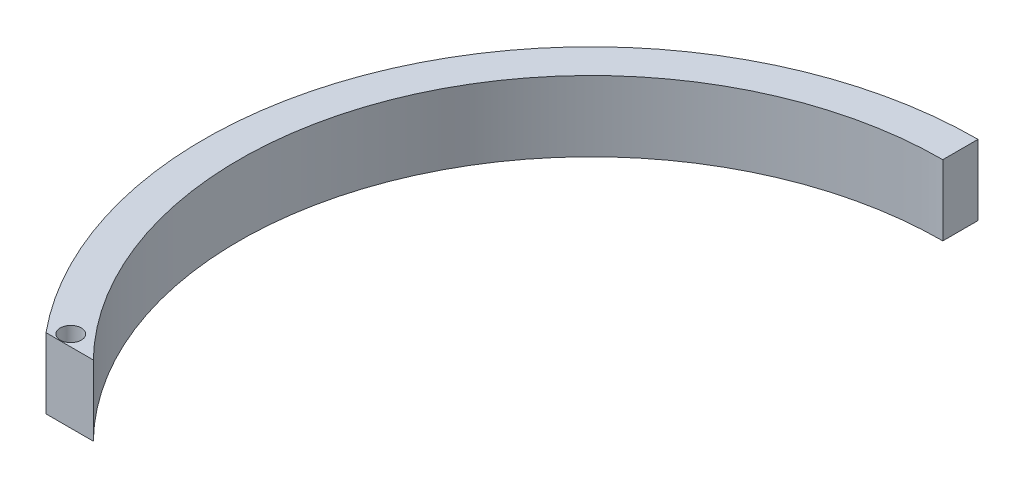
ISO-10303-21;
HEADER;
FILE_DESCRIPTION(('STEP AP214'),'2;1');
FILE_NAME('part.step','',(''),(''),'','','');
FILE_SCHEMA(('AUTOMOTIVE_DESIGN { 1 0 10303 214 1 1 1 1 }'));
ENDSEC;
DATA;
#1=APPLICATION_CONTEXT('core data for automotive mechanical design processes');
#2=APPLICATION_PROTOCOL_DEFINITION('international standard','automotive_design',2000,#1);
#3=PRODUCT_CONTEXT('',#1,'mechanical');
#4=PRODUCT('Part','Part','',(#3));
#5=PRODUCT_RELATED_PRODUCT_CATEGORY('part','',(#4));
#6=PRODUCT_DEFINITION_FORMATION('','',#4);
#7=PRODUCT_DEFINITION_CONTEXT('part definition',#1,'design');
#8=PRODUCT_DEFINITION('design','',#6,#7);
#9=PRODUCT_DEFINITION_SHAPE('','',#8);
#10=(LENGTH_UNIT() NAMED_UNIT(*) SI_UNIT(.MILLI.,.METRE.));
#11=(NAMED_UNIT(*) PLANE_ANGLE_UNIT() SI_UNIT($,.RADIAN.));
#12=(NAMED_UNIT(*) SI_UNIT($,.STERADIAN.) SOLID_ANGLE_UNIT());
#13=UNCERTAINTY_MEASURE_WITH_UNIT(LENGTH_MEASURE(1.E-05),#10,'distance_accuracy_value','');
#14=(GEOMETRIC_REPRESENTATION_CONTEXT(3) GLOBAL_UNCERTAINTY_ASSIGNED_CONTEXT((#13)) GLOBAL_UNIT_ASSIGNED_CONTEXT((#10,
#11,#12)) REPRESENTATION_CONTEXT('',''));
#15=CARTESIAN_POINT('',(0.,0.,0.));
#16=DIRECTION('',(0.,0.,1.));
#17=DIRECTION('',(1.,0.,0.));
#18=AXIS2_PLACEMENT_3D('',#15,#16,#17);
#19=CARTESIAN_POINT('',(0.,10.,0.));
#20=DIRECTION('',(0.,1.,0.));
#21=DIRECTION('',(0.,0.,1.));
#22=AXIS2_PLACEMENT_3D('',#19,#20,#21);
#23=PLANE('',#22);
#24=CARTESIAN_POINT('',(0.,10.,0.));
#25=DIRECTION('',(0.,1.,0.));
#26=DIRECTION('',(0.,0.,1.));
#27=AXIS2_PLACEMENT_3D('',#24,#25,#26);
#28=CIRCLE('',#27,55.);
#29=CARTESIAN_POINT('',(0.,10.,-55.));
#30=VERTEX_POINT('',#29);
#31=CARTESIAN_POINT('',(-42.4264068711928,10.,35.));
#32=VERTEX_POINT('',#31);
#33=EDGE_CURVE('E84',#30,#32,#28,.T.);
#34=ORIENTED_EDGE('',*,*,#33,.T.);
#35=DIRECTION('',(1.,0.,0.));
#36=VECTOR('',#35,1.);
#37=CARTESIAN_POINT('',(-35.7071421427143,10.,35.));
#38=LINE('',#37,#36);
#39=CARTESIAN_POINT('',(-35.7071421427143,10.,35.));
#40=VERTEX_POINT('',#39);
#41=EDGE_CURVE('E79',#32,#40,#38,.T.);
#42=ORIENTED_EDGE('',*,*,#41,.T.);
#43=CARTESIAN_POINT('',(0.,10.,0.));
#44=DIRECTION('',(0.,-1.,0.));
#45=DIRECTION('',(0.,0.,1.));
#46=AXIS2_PLACEMENT_3D('',#43,#44,#45);
#47=CIRCLE('',#46,50.);
#48=CARTESIAN_POINT('',(0.,10.,-50.));
#49=VERTEX_POINT('',#48);
#50=EDGE_CURVE('E82',#40,#49,#47,.T.);
#51=ORIENTED_EDGE('',*,*,#50,.T.);
#52=DIRECTION('',(0.,0.,-1.));
#53=VECTOR('',#52,1.);
#54=CARTESIAN_POINT('',(0.,10.,-55.));
#55=LINE('',#54,#53);
#56=EDGE_CURVE('E49',#49,#30,#55,.T.);
#57=ORIENTED_EDGE('',*,*,#56,.T.);
#58=EDGE_LOOP('',(#34,#42,#51,#57));
#59=FACE_BOUND('',#58,.T.);
#60=CARTESIAN_POINT('',(-40.4979338315932,10.,33.4090909090909));
#61=DIRECTION('',(0.,1.,0.));
#62=DIRECTION('',(0.,0.,1.));
#63=AXIS2_PLACEMENT_3D('',#60,#61,#62);
#64=CIRCLE('',#63,1.5);
#65=CARTESIAN_POINT('',(-40.4979338315932,10.,34.9090909090909));
#66=VERTEX_POINT('',#65);
#67=EDGE_CURVE('E99',#66,#66,#64,.T.);
#68=ORIENTED_EDGE('',*,*,#67,.F.);
#69=EDGE_LOOP('',(#68));
#70=FACE_BOUND('',#69,.T.);
#71=ADVANCED_FACE('F32',(#59,#70),#23,.T.);
#72=CARTESIAN_POINT('',(0.,0.,0.));
#73=DIRECTION('',(0.,1.,0.));
#74=DIRECTION('',(0.,0.,1.));
#75=AXIS2_PLACEMENT_3D('',#72,#73,#74);
#76=PLANE('',#75);
#77=CARTESIAN_POINT('',(0.,0.,0.));
#78=DIRECTION('',(0.,1.,0.));
#79=DIRECTION('',(0.,0.,1.));
#80=AXIS2_PLACEMENT_3D('',#77,#78,#79);
#81=CIRCLE('',#80,55.);
#82=CARTESIAN_POINT('',(0.,0.,-55.));
#83=VERTEX_POINT('',#82);
#84=CARTESIAN_POINT('',(-42.4264068711928,0.,35.));
#85=VERTEX_POINT('',#84);
#86=EDGE_CURVE('E96',#83,#85,#81,.T.);
#87=ORIENTED_EDGE('',*,*,#86,.F.);
#88=DIRECTION('',(0.,0.,-1.));
#89=VECTOR('',#88,1.);
#90=CARTESIAN_POINT('',(0.,0.,-55.));
#91=LINE('',#90,#89);
#92=CARTESIAN_POINT('',(0.,0.,-50.));
#93=VERTEX_POINT('',#92);
#94=EDGE_CURVE('E72',#93,#83,#91,.T.);
#95=ORIENTED_EDGE('',*,*,#94,.F.);
#96=CARTESIAN_POINT('',(0.,0.,0.));
#97=DIRECTION('',(0.,-1.,0.));
#98=DIRECTION('',(0.,0.,1.));
#99=AXIS2_PLACEMENT_3D('',#96,#97,#98);
#100=CIRCLE('',#99,50.);
#101=CARTESIAN_POINT('',(-35.7071421427143,0.,35.));
#102=VERTEX_POINT('',#101);
#103=EDGE_CURVE('E66',#102,#93,#100,.T.);
#104=ORIENTED_EDGE('',*,*,#103,.F.);
#105=DIRECTION('',(1.,0.,0.));
#106=VECTOR('',#105,1.);
#107=CARTESIAN_POINT('',(-35.7071421427143,0.,35.));
#108=LINE('',#107,#106);
#109=EDGE_CURVE('E88',#85,#102,#108,.T.);
#110=ORIENTED_EDGE('',*,*,#109,.F.);
#111=EDGE_LOOP('',(#87,#95,#104,#110));
#112=FACE_BOUND('',#111,.T.);
#113=CARTESIAN_POINT('',(-40.4979338315932,0.,33.4090909090909));
#114=DIRECTION('',(0.,1.,0.));
#115=DIRECTION('',(0.,0.,1.));
#116=AXIS2_PLACEMENT_3D('',#113,#114,#115);
#117=CIRCLE('',#116,1.5);
#118=CARTESIAN_POINT('',(-40.4979338315932,0.,34.9090909090909));
#119=VERTEX_POINT('',#118);
#120=EDGE_CURVE('E111',#119,#119,#117,.T.);
#121=ORIENTED_EDGE('',*,*,#120,.T.);
#122=EDGE_LOOP('',(#121));
#123=FACE_BOUND('',#122,.T.);
#124=ADVANCED_FACE('F107',(#112,#123),#76,.F.);
#125=CARTESIAN_POINT('',(0.,10.,0.));
#126=DIRECTION('',(0.,-1.,0.));
#127=DIRECTION('',(0.,0.,-1.));
#128=AXIS2_PLACEMENT_3D('',#125,#126,#127);
#129=CYLINDRICAL_SURFACE('',#128,55.);
#130=ORIENTED_EDGE('',*,*,#86,.T.);
#131=DIRECTION('',(0.,-1.,0.));
#132=VECTOR('',#131,1.);
#133=CARTESIAN_POINT('',(-42.4264068711928,10.,35.));
#134=LINE('',#133,#132);
#135=EDGE_CURVE('E11',#32,#85,#134,.T.);
#136=ORIENTED_EDGE('',*,*,#135,.F.);
#137=ORIENTED_EDGE('',*,*,#33,.F.);
#138=DIRECTION('',(0.,-1.,0.));
#139=VECTOR('',#138,1.);
#140=CARTESIAN_POINT('',(0.,10.,-55.));
#141=LINE('',#140,#139);
#142=EDGE_CURVE('E92',#30,#83,#141,.T.);
#143=ORIENTED_EDGE('',*,*,#142,.T.);
#144=EDGE_LOOP('',(#130,#136,#137,#143));
#145=FACE_BOUND('',#144,.T.);
#146=ADVANCED_FACE('F34',(#145),#129,.T.);
#147=CARTESIAN_POINT('',(-35.7071421427143,10.,35.));
#148=DIRECTION('',(0.,0.,-1.));
#149=DIRECTION('',(-1.,0.,0.));
#150=AXIS2_PLACEMENT_3D('',#147,#148,#149);
#151=PLANE('',#150);
#152=ORIENTED_EDGE('',*,*,#109,.T.);
#153=DIRECTION('',(0.,-1.,0.));
#154=VECTOR('',#153,1.);
#155=CARTESIAN_POINT('',(-35.7071421427143,10.,35.));
#156=LINE('',#155,#154);
#157=EDGE_CURVE('E41',#40,#102,#156,.T.);
#158=ORIENTED_EDGE('',*,*,#157,.F.);
#159=ORIENTED_EDGE('',*,*,#41,.F.);
#160=ORIENTED_EDGE('',*,*,#135,.T.);
#161=EDGE_LOOP('',(#152,#158,#159,#160));
#162=FACE_BOUND('',#161,.T.);
#163=ADVANCED_FACE('F87',(#162),#151,.F.);
#164=CARTESIAN_POINT('',(0.,10.,0.));
#165=DIRECTION('',(0.,-1.,0.));
#166=DIRECTION('',(0.,0.,-1.));
#167=AXIS2_PLACEMENT_3D('',#164,#165,#166);
#168=CYLINDRICAL_SURFACE('',#167,50.);
#169=ORIENTED_EDGE('',*,*,#103,.T.);
#170=DIRECTION('',(0.,-1.,0.));
#171=VECTOR('',#170,1.);
#172=CARTESIAN_POINT('',(0.,10.,-50.));
#173=LINE('',#172,#171);
#174=EDGE_CURVE('E89',#49,#93,#173,.T.);
#175=ORIENTED_EDGE('',*,*,#174,.F.);
#176=ORIENTED_EDGE('',*,*,#50,.F.);
#177=ORIENTED_EDGE('',*,*,#157,.T.);
#178=EDGE_LOOP('',(#169,#175,#176,#177));
#179=FACE_BOUND('',#178,.T.);
#180=ADVANCED_FACE('F90',(#179),#168,.F.);
#181=CARTESIAN_POINT('',(0.,10.,-55.));
#182=DIRECTION('',(-1.,0.,0.));
#183=DIRECTION('',(0.,0.,1.));
#184=AXIS2_PLACEMENT_3D('',#181,#182,#183);
#185=PLANE('',#184);
#186=ORIENTED_EDGE('',*,*,#94,.T.);
#187=ORIENTED_EDGE('',*,*,#142,.F.);
#188=ORIENTED_EDGE('',*,*,#56,.F.);
#189=ORIENTED_EDGE('',*,*,#174,.T.);
#190=EDGE_LOOP('',(#186,#187,#188,#189));
#191=FACE_BOUND('',#190,.T.);
#192=ADVANCED_FACE('F104',(#191),#185,.F.);
#193=CARTESIAN_POINT('',(-40.4979338315932,10.,33.4090909090909));
#194=DIRECTION('',(0.,-1.,0.));
#195=DIRECTION('',(0.,0.,-1.));
#196=AXIS2_PLACEMENT_3D('',#193,#194,#195);
#197=CYLINDRICAL_SURFACE('',#196,1.5);
#198=ORIENTED_EDGE('',*,*,#67,.T.);
#199=EDGE_LOOP('',(#198));
#200=FACE_BOUND('',#199,.T.);
#201=ORIENTED_EDGE('',*,*,#120,.F.);
#202=EDGE_LOOP('',(#201));
#203=FACE_BOUND('',#202,.T.);
#204=ADVANCED_FACE('F117',(#200,#203),#197,.F.);
#205=CLOSED_SHELL('',(#71,#124,#146,#163,#180,#192,#204));
#206=MANIFOLD_SOLID_BREP('B2',#205);
#207=ADVANCED_BREP_SHAPE_REPRESENTATION('',(#18,#206),#14);
#208=SHAPE_DEFINITION_REPRESENTATION(#9,#207);
ENDSEC;
END-ISO-10303-21;
